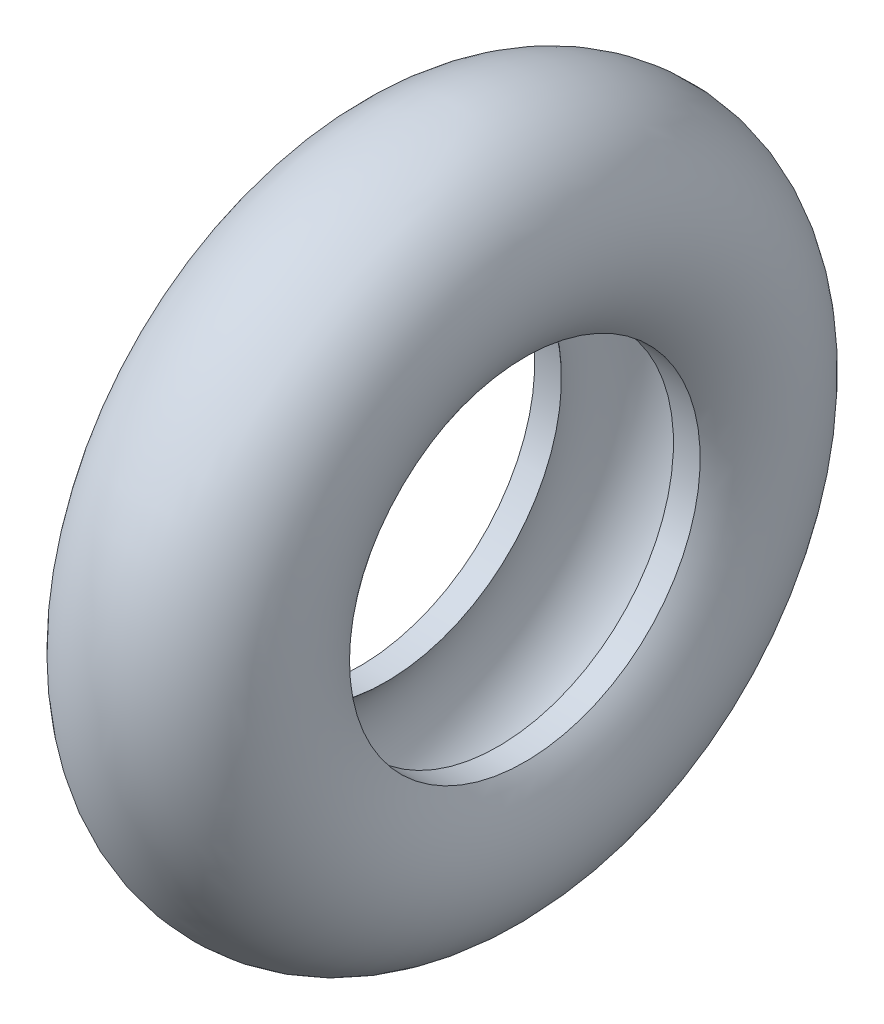
ISO-10303-21;
HEADER;
FILE_DESCRIPTION(('STEP AP214'),'2;1');
FILE_NAME('part.step','',(''),(''),'','','');
FILE_SCHEMA(('AUTOMOTIVE_DESIGN { 1 0 10303 214 1 1 1 1 }'));
ENDSEC;
DATA;
#1=APPLICATION_CONTEXT('core data for automotive mechanical design processes');
#2=APPLICATION_PROTOCOL_DEFINITION('international standard','automotive_design',2000,#1);
#3=PRODUCT_CONTEXT('',#1,'mechanical');
#4=PRODUCT('Part','Part','',(#3));
#5=PRODUCT_RELATED_PRODUCT_CATEGORY('part','',(#4));
#6=PRODUCT_DEFINITION_FORMATION('','',#4);
#7=PRODUCT_DEFINITION_CONTEXT('part definition',#1,'design');
#8=PRODUCT_DEFINITION('design','',#6,#7);
#9=PRODUCT_DEFINITION_SHAPE('','',#8);
#10=(LENGTH_UNIT() NAMED_UNIT(*) SI_UNIT(.MILLI.,.METRE.));
#11=(NAMED_UNIT(*) PLANE_ANGLE_UNIT() SI_UNIT($,.RADIAN.));
#12=(NAMED_UNIT(*) SI_UNIT($,.STERADIAN.) SOLID_ANGLE_UNIT());
#13=UNCERTAINTY_MEASURE_WITH_UNIT(LENGTH_MEASURE(1.E-05),#10,'distance_accuracy_value','');
#14=(GEOMETRIC_REPRESENTATION_CONTEXT(3) GLOBAL_UNCERTAINTY_ASSIGNED_CONTEXT((#13)) GLOBAL_UNIT_ASSIGNED_CONTEXT((#10,
#11,#12)) REPRESENTATION_CONTEXT('',''));
#15=CARTESIAN_POINT('',(0.,0.,0.));
#16=DIRECTION('',(0.,0.,1.));
#17=DIRECTION('',(1.,0.,0.));
#18=AXIS2_PLACEMENT_3D('',#15,#16,#17);
#19=CARTESIAN_POINT('',(0.,0.,0.));
#20=DIRECTION('',(-1.,0.,0.));
#21=DIRECTION('',(0.,0.,1.));
#22=AXIS2_PLACEMENT_3D('',#19,#20,#21);
#23=TOROIDAL_SURFACE('',#22,128.44,56.555);
#24=CARTESIAN_POINT('',(-43.6239571914589,0.,0.));
#25=DIRECTION('',(-1.,0.,0.));
#26=DIRECTION('',(0.,0.,1.));
#27=AXIS2_PLACEMENT_3D('',#24,#25,#26);
#28=CIRCLE('',#27,92.4480789070969);
#29=CARTESIAN_POINT('',(-43.6239571914589,0.,92.4480789070969));
#30=VERTEX_POINT('',#29);
#31=EDGE_CURVE('E10',#30,#30,#28,.T.);
#32=ORIENTED_EDGE('',*,*,#31,.F.);
#33=EDGE_LOOP('',(#32));
#34=FACE_BOUND('',#33,.T.);
#35=CARTESIAN_POINT('',(43.6239571914589,0.,0.));
#36=DIRECTION('',(-1.,0.,0.));
#37=DIRECTION('',(0.,0.,1.));
#38=AXIS2_PLACEMENT_3D('',#35,#36,#37);
#39=CIRCLE('',#38,92.4480789070969);
#40=CARTESIAN_POINT('',(43.6239571914589,0.,92.4480789070969));
#41=VERTEX_POINT('',#40);
#42=EDGE_CURVE('E45',#41,#41,#39,.T.);
#43=ORIENTED_EDGE('',*,*,#42,.T.);
#44=EDGE_LOOP('',(#43));
#45=FACE_BOUND('',#44,.T.);
#46=ADVANCED_FACE('F31',(#34,#45),#23,.T.);
#47=CARTESIAN_POINT('',(-106.608138564992,0.,0.));
#48=DIRECTION('',(-1.,0.,0.));
#49=DIRECTION('',(0.,0.,1.));
#50=AXIS2_PLACEMENT_3D('',#47,#48,#49);
#51=CYLINDRICAL_SURFACE('',#50,92.4480789070969);
#52=CARTESIAN_POINT('',(-29.5287934234069,0.,0.));
#53=DIRECTION('',(-1.,0.,0.));
#54=DIRECTION('',(0.,0.,1.));
#55=AXIS2_PLACEMENT_3D('',#52,#53,#54);
#56=CIRCLE('',#55,92.4480789070969);
#57=CARTESIAN_POINT('',(-29.5287934234069,0.,92.4480789070969));
#58=VERTEX_POINT('',#57);
#59=EDGE_CURVE('E37',#58,#58,#56,.T.);
#60=ORIENTED_EDGE('',*,*,#59,.F.);
#61=EDGE_LOOP('',(#60));
#62=FACE_BOUND('',#61,.T.);
#63=ORIENTED_EDGE('',*,*,#31,.T.);
#64=EDGE_LOOP('',(#63));
#65=FACE_BOUND('',#64,.T.);
#66=ADVANCED_FACE('F60',(#62,#65),#51,.F.);
#67=CARTESIAN_POINT('',(0.,0.,0.));
#68=DIRECTION('',(-1.,0.,0.));
#69=DIRECTION('',(0.,0.,1.));
#70=AXIS2_PLACEMENT_3D('',#67,#68,#69);
#71=TOROIDAL_SURFACE('',#70,128.44,46.555);
#72=CARTESIAN_POINT('',(29.5287934234069,0.,0.));
#73=DIRECTION('',(-1.,0.,0.));
#74=DIRECTION('',(0.,0.,1.));
#75=AXIS2_PLACEMENT_3D('',#72,#73,#74);
#76=CIRCLE('',#75,92.4480789070969);
#77=CARTESIAN_POINT('',(29.5287934234069,0.,92.4480789070969));
#78=VERTEX_POINT('',#77);
#79=EDGE_CURVE('E41',#78,#78,#76,.T.);
#80=ORIENTED_EDGE('',*,*,#79,.F.);
#81=EDGE_LOOP('',(#80));
#82=FACE_BOUND('',#81,.T.);
#83=ORIENTED_EDGE('',*,*,#59,.T.);
#84=EDGE_LOOP('',(#83));
#85=FACE_BOUND('',#84,.T.);
#86=ADVANCED_FACE('F55',(#82,#85),#71,.F.);
#87=CARTESIAN_POINT('',(-106.608138564992,0.,0.));
#88=DIRECTION('',(-1.,0.,0.));
#89=DIRECTION('',(0.,0.,1.));
#90=AXIS2_PLACEMENT_3D('',#87,#88,#89);
#91=CYLINDRICAL_SURFACE('',#90,92.4480789070969);
#92=ORIENTED_EDGE('',*,*,#42,.F.);
#93=EDGE_LOOP('',(#92));
#94=FACE_BOUND('',#93,.T.);
#95=ORIENTED_EDGE('',*,*,#79,.T.);
#96=EDGE_LOOP('',(#95));
#97=FACE_BOUND('',#96,.T.);
#98=ADVANCED_FACE('F52',(#94,#97),#91,.F.);
#99=CLOSED_SHELL('',(#46,#66,#86,#98));
#100=MANIFOLD_SOLID_BREP('B2',#99);
#101=ADVANCED_BREP_SHAPE_REPRESENTATION('',(#18,#100),#14);
#102=SHAPE_DEFINITION_REPRESENTATION(#9,#101);
ENDSEC;
END-ISO-10303-21;
